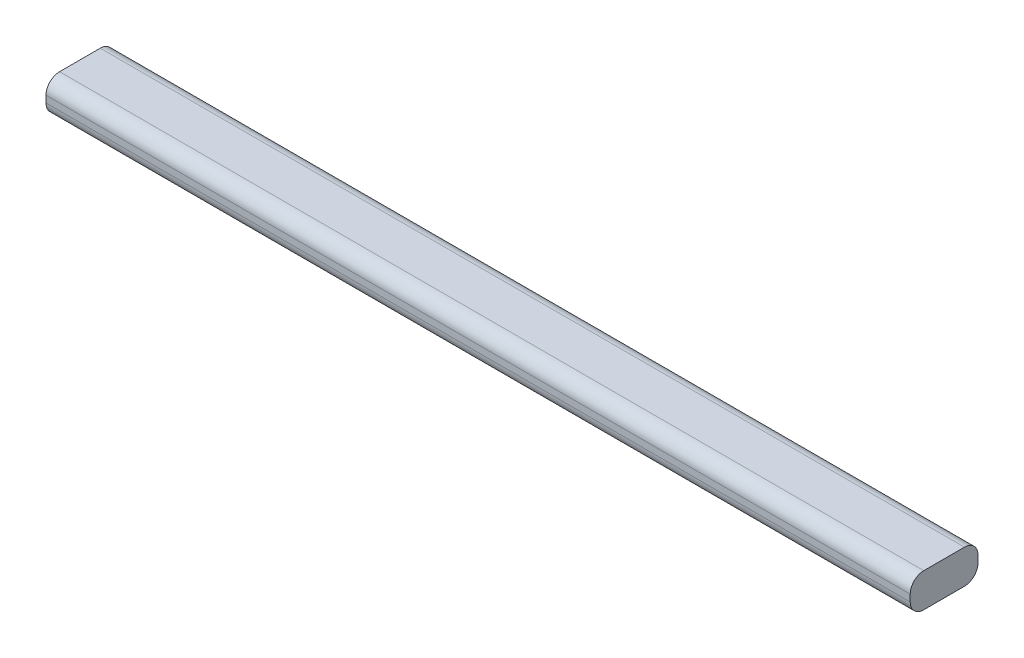
ISO-10303-21;
HEADER;
FILE_DESCRIPTION(('STEP AP214'),'2;1');
FILE_NAME('part.step','',(''),(''),'','','');
FILE_SCHEMA(('AUTOMOTIVE_DESIGN { 1 0 10303 214 1 1 1 1 }'));
ENDSEC;
DATA;
#1=APPLICATION_CONTEXT('core data for automotive mechanical design processes');
#2=APPLICATION_PROTOCOL_DEFINITION('international standard','automotive_design',2000,#1);
#3=PRODUCT_CONTEXT('',#1,'mechanical');
#4=PRODUCT('Part','Part','',(#3));
#5=PRODUCT_RELATED_PRODUCT_CATEGORY('part','',(#4));
#6=PRODUCT_DEFINITION_FORMATION('','',#4);
#7=PRODUCT_DEFINITION_CONTEXT('part definition',#1,'design');
#8=PRODUCT_DEFINITION('design','',#6,#7);
#9=PRODUCT_DEFINITION_SHAPE('','',#8);
#10=(LENGTH_UNIT() NAMED_UNIT(*) SI_UNIT(.MILLI.,.METRE.));
#11=(NAMED_UNIT(*) PLANE_ANGLE_UNIT() SI_UNIT($,.RADIAN.));
#12=(NAMED_UNIT(*) SI_UNIT($,.STERADIAN.) SOLID_ANGLE_UNIT());
#13=UNCERTAINTY_MEASURE_WITH_UNIT(LENGTH_MEASURE(1.E-05),#10,'distance_accuracy_value','');
#14=(GEOMETRIC_REPRESENTATION_CONTEXT(3) GLOBAL_UNCERTAINTY_ASSIGNED_CONTEXT((#13)) GLOBAL_UNIT_ASSIGNED_CONTEXT((#10,
#11,#12)) REPRESENTATION_CONTEXT('',''));
#15=CARTESIAN_POINT('',(0.,0.,0.));
#16=DIRECTION('',(0.,0.,1.));
#17=DIRECTION('',(1.,0.,0.));
#18=AXIS2_PLACEMENT_3D('',#15,#16,#17);
#19=CARTESIAN_POINT('',(-63.75,2.,-3.));
#20=DIRECTION('',(-1.,0.,0.));
#21=DIRECTION('',(0.,0.,1.));
#22=AXIS2_PLACEMENT_3D('',#19,#20,#21);
#23=CYLINDRICAL_SURFACE('',#22,2.);
#24=DIRECTION('',(-1.,0.,0.));
#25=VECTOR('',#24,1.);
#26=CARTESIAN_POINT('',(-63.75,2.,-5.));
#27=LINE('',#26,#25);
#28=CARTESIAN_POINT('',(63.75,2.,-5.00000000000001));
#29=VERTEX_POINT('',#28);
#30=CARTESIAN_POINT('',(-63.75,2.,-5.));
#31=VERTEX_POINT('',#30);
#32=EDGE_CURVE('E146',#29,#31,#27,.T.);
#33=ORIENTED_EDGE('',*,*,#32,.F.);
#34=CARTESIAN_POINT('',(63.75,2.,-3.00000000000001));
#35=DIRECTION('',(-1.,0.,0.));
#36=DIRECTION('',(0.,0.,1.));
#37=AXIS2_PLACEMENT_3D('',#34,#35,#36);
#38=CIRCLE('',#37,2.);
#39=CARTESIAN_POINT('',(63.75,0.,-3.00000000000001));
#40=VERTEX_POINT('',#39);
#41=EDGE_CURVE('E39',#40,#29,#38,.F.);
#42=ORIENTED_EDGE('',*,*,#41,.F.);
#43=DIRECTION('',(-1.,0.,0.));
#44=VECTOR('',#43,1.);
#45=CARTESIAN_POINT('',(0.,0.,-3.));
#46=LINE('',#45,#44);
#47=CARTESIAN_POINT('',(-63.75,0.,-3.));
#48=VERTEX_POINT('',#47);
#49=EDGE_CURVE('E149',#48,#40,#46,.F.);
#50=ORIENTED_EDGE('',*,*,#49,.F.);
#51=CARTESIAN_POINT('',(-63.75,2.,-3.));
#52=DIRECTION('',(1.,0.,0.));
#53=DIRECTION('',(0.,0.,-1.));
#54=AXIS2_PLACEMENT_3D('',#51,#52,#53);
#55=CIRCLE('',#54,2.);
#56=EDGE_CURVE('E11',#31,#48,#55,.F.);
#57=ORIENTED_EDGE('',*,*,#56,.F.);
#58=EDGE_LOOP('',(#33,#42,#50,#57));
#59=FACE_BOUND('',#58,.T.);
#60=ADVANCED_FACE('F32',(#59),#23,.T.);
#61=CARTESIAN_POINT('',(0.,3.,-3.));
#62=DIRECTION('',(1.,0.,0.));
#63=DIRECTION('',(0.,0.,-1.));
#64=AXIS2_PLACEMENT_3D('',#61,#62,#63);
#65=CYLINDRICAL_SURFACE('',#64,2.);
#66=DIRECTION('',(-1.,0.,0.));
#67=VECTOR('',#66,1.);
#68=CARTESIAN_POINT('',(0.,5.,-3.));
#69=LINE('',#68,#67);
#70=CARTESIAN_POINT('',(63.75,5.,-3.00000000000001));
#71=VERTEX_POINT('',#70);
#72=CARTESIAN_POINT('',(-63.75,5.,-3.));
#73=VERTEX_POINT('',#72);
#74=EDGE_CURVE('E136',#71,#73,#69,.T.);
#75=ORIENTED_EDGE('',*,*,#74,.F.);
#76=CARTESIAN_POINT('',(63.75,3.,-3.00000000000001));
#77=DIRECTION('',(-1.,0.,0.));
#78=DIRECTION('',(0.,0.,1.));
#79=AXIS2_PLACEMENT_3D('',#76,#77,#78);
#80=CIRCLE('',#79,2.);
#81=CARTESIAN_POINT('',(63.75,3.,-5.00000000000001));
#82=VERTEX_POINT('',#81);
#83=EDGE_CURVE('E142',#82,#71,#80,.F.);
#84=ORIENTED_EDGE('',*,*,#83,.F.);
#85=DIRECTION('',(-1.,0.,0.));
#86=VECTOR('',#85,1.);
#87=CARTESIAN_POINT('',(0.,3.,-5.));
#88=LINE('',#87,#86);
#89=CARTESIAN_POINT('',(-63.75,3.,-5.));
#90=VERTEX_POINT('',#89);
#91=EDGE_CURVE('E139',#90,#82,#88,.F.);
#92=ORIENTED_EDGE('',*,*,#91,.F.);
#93=CARTESIAN_POINT('',(-63.75,3.,-3.));
#94=DIRECTION('',(1.,0.,0.));
#95=DIRECTION('',(0.,0.,-1.));
#96=AXIS2_PLACEMENT_3D('',#93,#94,#95);
#97=CIRCLE('',#96,2.);
#98=EDGE_CURVE('E144',#73,#90,#97,.F.);
#99=ORIENTED_EDGE('',*,*,#98,.F.);
#100=EDGE_LOOP('',(#75,#84,#92,#99));
#101=FACE_BOUND('',#100,.T.);
#102=ADVANCED_FACE('F159',(#101),#65,.T.);
#103=CARTESIAN_POINT('',(-63.75,2.,3.));
#104=DIRECTION('',(1.,0.,0.));
#105=DIRECTION('',(0.,0.,-1.));
#106=AXIS2_PLACEMENT_3D('',#103,#104,#105);
#107=CYLINDRICAL_SURFACE('',#106,2.);
#108=DIRECTION('',(1.,0.,0.));
#109=VECTOR('',#108,1.);
#110=CARTESIAN_POINT('',(-63.75,2.,5.));
#111=LINE('',#110,#109);
#112=CARTESIAN_POINT('',(-63.75,2.,5.));
#113=VERTEX_POINT('',#112);
#114=CARTESIAN_POINT('',(63.75,2.,4.99999999999999));
#115=VERTEX_POINT('',#114);
#116=EDGE_CURVE('E118',#113,#115,#111,.T.);
#117=ORIENTED_EDGE('',*,*,#116,.F.);
#118=CARTESIAN_POINT('',(-63.75,2.,3.));
#119=DIRECTION('',(1.,0.,0.));
#120=DIRECTION('',(0.,0.,-1.));
#121=AXIS2_PLACEMENT_3D('',#118,#119,#120);
#122=CIRCLE('',#121,2.);
#123=CARTESIAN_POINT('',(-63.75,0.,3.));
#124=VERTEX_POINT('',#123);
#125=EDGE_CURVE('E132',#124,#113,#122,.F.);
#126=ORIENTED_EDGE('',*,*,#125,.F.);
#127=DIRECTION('',(1.,0.,0.));
#128=VECTOR('',#127,1.);
#129=CARTESIAN_POINT('',(0.,0.,3.));
#130=LINE('',#129,#128);
#131=CARTESIAN_POINT('',(63.75,0.,2.99999999999999));
#132=VERTEX_POINT('',#131);
#133=EDGE_CURVE('E129',#132,#124,#130,.F.);
#134=ORIENTED_EDGE('',*,*,#133,.F.);
#135=CARTESIAN_POINT('',(63.75,2.,2.99999999999999));
#136=DIRECTION('',(-1.,0.,0.));
#137=DIRECTION('',(0.,0.,1.));
#138=AXIS2_PLACEMENT_3D('',#135,#136,#137);
#139=CIRCLE('',#138,2.);
#140=EDGE_CURVE('E134',#115,#132,#139,.F.);
#141=ORIENTED_EDGE('',*,*,#140,.F.);
#142=EDGE_LOOP('',(#117,#126,#134,#141));
#143=FACE_BOUND('',#142,.T.);
#144=ADVANCED_FACE('F176',(#143),#107,.T.);
#145=CARTESIAN_POINT('',(-63.75,3.,3.));
#146=DIRECTION('',(1.,0.,0.));
#147=DIRECTION('',(0.,0.,-1.));
#148=AXIS2_PLACEMENT_3D('',#145,#146,#147);
#149=CYLINDRICAL_SURFACE('',#148,2.);
#150=DIRECTION('',(-1.,0.,0.));
#151=VECTOR('',#150,1.);
#152=CARTESIAN_POINT('',(-63.75,3.,5.));
#153=LINE('',#152,#151);
#154=CARTESIAN_POINT('',(63.75,3.,4.99999999999999));
#155=VERTEX_POINT('',#154);
#156=CARTESIAN_POINT('',(-63.75,3.,5.));
#157=VERTEX_POINT('',#156);
#158=EDGE_CURVE('E108',#155,#157,#153,.T.);
#159=ORIENTED_EDGE('',*,*,#158,.F.);
#160=CARTESIAN_POINT('',(63.75,3.,2.99999999999999));
#161=DIRECTION('',(-1.,0.,0.));
#162=DIRECTION('',(0.,0.,1.));
#163=AXIS2_PLACEMENT_3D('',#160,#161,#162);
#164=CIRCLE('',#163,2.);
#165=CARTESIAN_POINT('',(63.75,5.,2.99999999999999));
#166=VERTEX_POINT('',#165);
#167=EDGE_CURVE('E93',#166,#155,#164,.F.);
#168=ORIENTED_EDGE('',*,*,#167,.F.);
#169=DIRECTION('',(-1.,0.,0.));
#170=VECTOR('',#169,1.);
#171=CARTESIAN_POINT('',(-63.75,5.,3.));
#172=LINE('',#171,#170);
#173=CARTESIAN_POINT('',(-63.75,5.,3.));
#174=VERTEX_POINT('',#173);
#175=EDGE_CURVE('E105',#174,#166,#172,.F.);
#176=ORIENTED_EDGE('',*,*,#175,.F.);
#177=CARTESIAN_POINT('',(-63.75,3.,3.));
#178=DIRECTION('',(1.,0.,0.));
#179=DIRECTION('',(0.,0.,-1.));
#180=AXIS2_PLACEMENT_3D('',#177,#178,#179);
#181=CIRCLE('',#180,2.);
#182=EDGE_CURVE('E104',#157,#174,#181,.F.);
#183=ORIENTED_EDGE('',*,*,#182,.F.);
#184=EDGE_LOOP('',(#159,#168,#176,#183));
#185=FACE_BOUND('',#184,.T.);
#186=ADVANCED_FACE('F109',(#185),#149,.T.);
#187=CARTESIAN_POINT('',(-63.75,5.,5.));
#188=DIRECTION('',(0.,0.,-1.));
#189=DIRECTION('',(-1.,0.,0.));
#190=AXIS2_PLACEMENT_3D('',#187,#188,#189);
#191=PLANE('',#190);
#192=DIRECTION('',(0.,-1.,0.));
#193=VECTOR('',#192,1.);
#194=CARTESIAN_POINT('',(-63.75,5.,5.));
#195=LINE('',#194,#193);
#196=EDGE_CURVE('E166',#157,#113,#195,.T.);
#197=ORIENTED_EDGE('',*,*,#196,.T.);
#198=ORIENTED_EDGE('',*,*,#116,.T.);
#199=DIRECTION('',(0.,-1.,0.));
#200=VECTOR('',#199,1.);
#201=CARTESIAN_POINT('',(63.75,5.,4.99999999999999));
#202=LINE('',#201,#200);
#203=EDGE_CURVE('E98',#155,#115,#202,.T.);
#204=ORIENTED_EDGE('',*,*,#203,.F.);
#205=ORIENTED_EDGE('',*,*,#158,.T.);
#206=EDGE_LOOP('',(#197,#198,#204,#205));
#207=FACE_BOUND('',#206,.T.);
#208=ADVANCED_FACE('F116',(#207),#191,.F.);
#209=CARTESIAN_POINT('',(63.75,5.,4.99999999999999));
#210=DIRECTION('',(-1.,0.,0.));
#211=DIRECTION('',(0.,0.,1.));
#212=AXIS2_PLACEMENT_3D('',#209,#210,#211);
#213=PLANE('',#212);
#214=DIRECTION('',(0.,0.,-1.));
#215=VECTOR('',#214,1.);
#216=CARTESIAN_POINT('',(63.75,0.,4.99999999999999));
#217=LINE('',#216,#215);
#218=EDGE_CURVE('E152',#132,#40,#217,.T.);
#219=ORIENTED_EDGE('',*,*,#218,.T.);
#220=ORIENTED_EDGE('',*,*,#41,.T.);
#221=DIRECTION('',(0.,-1.,0.));
#222=VECTOR('',#221,1.);
#223=CARTESIAN_POINT('',(63.75,5.,-5.00000000000001));
#224=LINE('',#223,#222);
#225=EDGE_CURVE('E119',#82,#29,#224,.T.);
#226=ORIENTED_EDGE('',*,*,#225,.F.);
#227=ORIENTED_EDGE('',*,*,#83,.T.);
#228=DIRECTION('',(0.,0.,-1.));
#229=VECTOR('',#228,1.);
#230=CARTESIAN_POINT('',(63.75,5.,4.99999999999999));
#231=LINE('',#230,#229);
#232=EDGE_CURVE('E100',#166,#71,#231,.T.);
#233=ORIENTED_EDGE('',*,*,#232,.F.);
#234=ORIENTED_EDGE('',*,*,#167,.T.);
#235=ORIENTED_EDGE('',*,*,#203,.T.);
#236=ORIENTED_EDGE('',*,*,#140,.T.);
#237=EDGE_LOOP('',(#219,#220,#226,#227,#233,#234,#235,#236));
#238=FACE_BOUND('',#237,.T.);
#239=ADVANCED_FACE('F96',(#238),#213,.F.);
#240=CARTESIAN_POINT('',(-63.75,5.,-5.));
#241=DIRECTION('',(0.,0.,1.));
#242=DIRECTION('',(1.,0.,0.));
#243=AXIS2_PLACEMENT_3D('',#240,#241,#242);
#244=PLANE('',#243);
#245=ORIENTED_EDGE('',*,*,#225,.T.);
#246=ORIENTED_EDGE('',*,*,#32,.T.);
#247=DIRECTION('',(0.,-1.,0.));
#248=VECTOR('',#247,1.);
#249=CARTESIAN_POINT('',(-63.75,5.,-5.));
#250=LINE('',#249,#248);
#251=EDGE_CURVE('E122',#90,#31,#250,.T.);
#252=ORIENTED_EDGE('',*,*,#251,.F.);
#253=ORIENTED_EDGE('',*,*,#91,.T.);
#254=EDGE_LOOP('',(#245,#246,#252,#253));
#255=FACE_BOUND('',#254,.T.);
#256=ADVANCED_FACE('F155',(#255),#244,.F.);
#257=CARTESIAN_POINT('',(-63.75,5.,5.));
#258=DIRECTION('',(1.,0.,0.));
#259=DIRECTION('',(0.,0.,-1.));
#260=AXIS2_PLACEMENT_3D('',#257,#258,#259);
#261=PLANE('',#260);
#262=ORIENTED_EDGE('',*,*,#251,.T.);
#263=ORIENTED_EDGE('',*,*,#56,.T.);
#264=DIRECTION('',(0.,0.,1.));
#265=VECTOR('',#264,1.);
#266=CARTESIAN_POINT('',(-63.75,0.,5.));
#267=LINE('',#266,#265);
#268=EDGE_CURVE('E164',#48,#124,#267,.T.);
#269=ORIENTED_EDGE('',*,*,#268,.T.);
#270=ORIENTED_EDGE('',*,*,#125,.T.);
#271=ORIENTED_EDGE('',*,*,#196,.F.);
#272=ORIENTED_EDGE('',*,*,#182,.T.);
#273=DIRECTION('',(0.,0.,1.));
#274=VECTOR('',#273,1.);
#275=CARTESIAN_POINT('',(-63.75,5.,5.));
#276=LINE('',#275,#274);
#277=EDGE_CURVE('E163',#73,#174,#276,.T.);
#278=ORIENTED_EDGE('',*,*,#277,.F.);
#279=ORIENTED_EDGE('',*,*,#98,.T.);
#280=EDGE_LOOP('',(#262,#263,#269,#270,#271,#272,#278,#279));
#281=FACE_BOUND('',#280,.T.);
#282=ADVANCED_FACE('F171',(#281),#261,.F.);
#283=CARTESIAN_POINT('',(0.,5.,0.));
#284=DIRECTION('',(0.,1.,0.));
#285=DIRECTION('',(0.,0.,1.));
#286=AXIS2_PLACEMENT_3D('',#283,#284,#285);
#287=PLANE('',#286);
#288=ORIENTED_EDGE('',*,*,#232,.T.);
#289=ORIENTED_EDGE('',*,*,#74,.T.);
#290=ORIENTED_EDGE('',*,*,#277,.T.);
#291=ORIENTED_EDGE('',*,*,#175,.T.);
#292=EDGE_LOOP('',(#288,#289,#290,#291));
#293=FACE_BOUND('',#292,.T.);
#294=ADVANCED_FACE('F162',(#293),#287,.T.);
#295=CARTESIAN_POINT('',(0.,0.,0.));
#296=DIRECTION('',(0.,1.,0.));
#297=DIRECTION('',(0.,0.,1.));
#298=AXIS2_PLACEMENT_3D('',#295,#296,#297);
#299=PLANE('',#298);
#300=ORIENTED_EDGE('',*,*,#268,.F.);
#301=ORIENTED_EDGE('',*,*,#49,.T.);
#302=ORIENTED_EDGE('',*,*,#218,.F.);
#303=ORIENTED_EDGE('',*,*,#133,.T.);
#304=EDGE_LOOP('',(#300,#301,#302,#303));
#305=FACE_BOUND('',#304,.T.);
#306=ADVANCED_FACE('F178',(#305),#299,.F.);
#307=CLOSED_SHELL('',(#60,#102,#144,#186,#208,#239,#256,#282,#294,#306));
#308=MANIFOLD_SOLID_BREP('B2',#307);
#309=ADVANCED_BREP_SHAPE_REPRESENTATION('',(#18,#308),#14);
#310=SHAPE_DEFINITION_REPRESENTATION(#9,#309);
ENDSEC;
END-ISO-10303-21;
